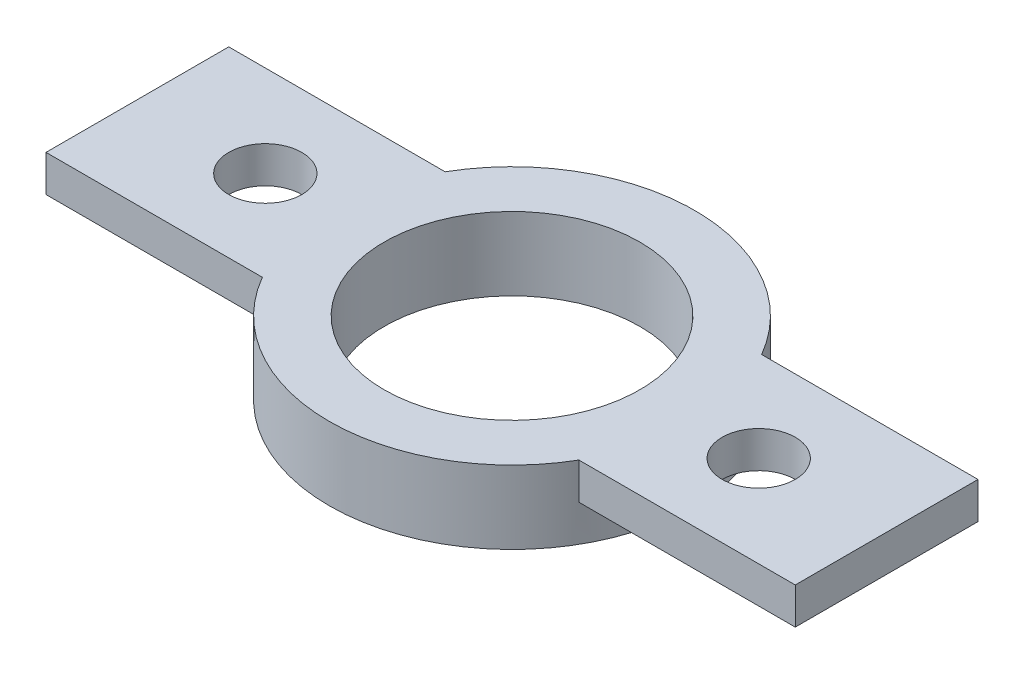
ISO-10303-21;
HEADER;
FILE_DESCRIPTION(('STEP AP214'),'2;1');
FILE_NAME('part.step','',(''),(''),'','','');
FILE_SCHEMA(('AUTOMOTIVE_DESIGN { 1 0 10303 214 1 1 1 1 }'));
ENDSEC;
DATA;
#1=APPLICATION_CONTEXT('core data for automotive mechanical design processes');
#2=APPLICATION_PROTOCOL_DEFINITION('international standard','automotive_design',2000,#1);
#3=PRODUCT_CONTEXT('',#1,'mechanical');
#4=PRODUCT('Part','Part','',(#3));
#5=PRODUCT_RELATED_PRODUCT_CATEGORY('part','',(#4));
#6=PRODUCT_DEFINITION_FORMATION('','',#4);
#7=PRODUCT_DEFINITION_CONTEXT('part definition',#1,'design');
#8=PRODUCT_DEFINITION('design','',#6,#7);
#9=PRODUCT_DEFINITION_SHAPE('','',#8);
#10=(LENGTH_UNIT() NAMED_UNIT(*) SI_UNIT(.MILLI.,.METRE.));
#11=(NAMED_UNIT(*) PLANE_ANGLE_UNIT() SI_UNIT($,.RADIAN.));
#12=(NAMED_UNIT(*) SI_UNIT($,.STERADIAN.) SOLID_ANGLE_UNIT());
#13=UNCERTAINTY_MEASURE_WITH_UNIT(LENGTH_MEASURE(1.E-05),#10,'distance_accuracy_value','');
#14=(GEOMETRIC_REPRESENTATION_CONTEXT(3) GLOBAL_UNCERTAINTY_ASSIGNED_CONTEXT((#13)) GLOBAL_UNIT_ASSIGNED_CONTEXT((#10,
#11,#12)) REPRESENTATION_CONTEXT('',''));
#15=CARTESIAN_POINT('',(0.,0.,0.));
#16=DIRECTION('',(0.,0.,1.));
#17=DIRECTION('',(1.,0.,0.));
#18=AXIS2_PLACEMENT_3D('',#15,#16,#17);
#19=CARTESIAN_POINT('',(0.,2.,0.));
#20=DIRECTION('',(0.,0.,-1.));
#21=DIRECTION('',(-1.,0.,0.));
#22=AXIS2_PLACEMENT_3D('',#19,#20,#21);
#23=PLANE('',#22);
#24=DIRECTION('',(1.,0.,0.));
#25=VECTOR('',#24,1.);
#26=CARTESIAN_POINT('',(0.,0.,0.));
#27=LINE('',#26,#25);
#28=CARTESIAN_POINT('',(-3.,0.,0.));
#29=VERTEX_POINT('',#28);
#30=CARTESIAN_POINT('',(8.83974596215561,0.,0.));
#31=VERTEX_POINT('',#30);
#32=EDGE_CURVE('E109',#29,#31,#27,.T.);
#33=ORIENTED_EDGE('',*,*,#32,.T.);
#34=DIRECTION('',(0.,1.,0.));
#35=VECTOR('',#34,1.);
#36=CARTESIAN_POINT('',(8.83974596215561,-2.,0.));
#37=LINE('',#36,#35);
#38=CARTESIAN_POINT('',(8.83974596215561,2.,0.));
#39=VERTEX_POINT('',#38);
#40=EDGE_CURVE('E162',#31,#39,#37,.T.);
#41=ORIENTED_EDGE('',*,*,#40,.T.);
#42=DIRECTION('',(1.,0.,0.));
#43=VECTOR('',#42,1.);
#44=CARTESIAN_POINT('',(0.,2.,0.));
#45=LINE('',#44,#43);
#46=CARTESIAN_POINT('',(-3.,2.,0.));
#47=VERTEX_POINT('',#46);
#48=EDGE_CURVE('E166',#47,#39,#45,.T.);
#49=ORIENTED_EDGE('',*,*,#48,.F.);
#50=DIRECTION('',(0.,1.,0.));
#51=VECTOR('',#50,1.);
#52=CARTESIAN_POINT('',(-3.,2.,0.));
#53=LINE('',#52,#51);
#54=EDGE_CURVE('E128',#29,#47,#53,.T.);
#55=ORIENTED_EDGE('',*,*,#54,.F.);
#56=EDGE_LOOP('',(#33,#41,#49,#55));
#57=FACE_BOUND('',#56,.T.);
#58=ADVANCED_FACE('F33',(#57),#23,.F.);
#59=CARTESIAN_POINT('',(0.,2.,-10.));
#60=DIRECTION('',(0.,0.,1.));
#61=DIRECTION('',(1.,0.,0.));
#62=AXIS2_PLACEMENT_3D('',#59,#60,#61);
#63=PLANE('',#62);
#64=DIRECTION('',(-1.,0.,0.));
#65=VECTOR('',#64,1.);
#66=CARTESIAN_POINT('',(0.,0.,-10.));
#67=LINE('',#66,#65);
#68=CARTESIAN_POINT('',(38.,0.,-10.));
#69=VERTEX_POINT('',#68);
#70=CARTESIAN_POINT('',(26.1602540378444,0.,-10.));
#71=VERTEX_POINT('',#70);
#72=EDGE_CURVE('E114',#69,#71,#67,.T.);
#73=ORIENTED_EDGE('',*,*,#72,.T.);
#74=DIRECTION('',(0.,1.,0.));
#75=VECTOR('',#74,1.);
#76=CARTESIAN_POINT('',(26.1602540378444,-2.,-10.));
#77=LINE('',#76,#75);
#78=CARTESIAN_POINT('',(26.1602540378444,2.,-10.));
#79=VERTEX_POINT('',#78);
#80=EDGE_CURVE('E58',#71,#79,#77,.T.);
#81=ORIENTED_EDGE('',*,*,#80,.T.);
#82=DIRECTION('',(-1.,0.,0.));
#83=VECTOR('',#82,1.);
#84=CARTESIAN_POINT('',(0.,2.,-10.));
#85=LINE('',#84,#83);
#86=CARTESIAN_POINT('',(38.,2.,-10.));
#87=VERTEX_POINT('',#86);
#88=EDGE_CURVE('E170',#87,#79,#85,.T.);
#89=ORIENTED_EDGE('',*,*,#88,.F.);
#90=DIRECTION('',(0.,1.,0.));
#91=VECTOR('',#90,1.);
#92=CARTESIAN_POINT('',(38.,0.,-10.));
#93=LINE('',#92,#91);
#94=EDGE_CURVE('E118',#69,#87,#93,.T.);
#95=ORIENTED_EDGE('',*,*,#94,.F.);
#96=EDGE_LOOP('',(#73,#81,#89,#95));
#97=FACE_BOUND('',#96,.T.);
#98=ADVANCED_FACE('F197',(#97),#63,.F.);
#99=CARTESIAN_POINT('',(0.,0.,0.));
#100=DIRECTION('',(0.,-1.,0.));
#101=DIRECTION('',(0.,0.,-1.));
#102=AXIS2_PLACEMENT_3D('',#99,#100,#101);
#103=PLANE('',#102);
#104=CARTESIAN_POINT('',(31.,0.,-5.));
#105=DIRECTION('',(0.,-1.,0.));
#106=DIRECTION('',(0.,0.,-1.));
#107=AXIS2_PLACEMENT_3D('',#104,#105,#106);
#108=CIRCLE('',#107,2.00000000000001);
#109=CARTESIAN_POINT('',(31.,0.,-7.00000000000001));
#110=VERTEX_POINT('',#109);
#111=EDGE_CURVE('E140',#110,#110,#108,.T.);
#112=ORIENTED_EDGE('',*,*,#111,.F.);
#113=EDGE_LOOP('',(#112));
#114=FACE_BOUND('',#113,.T.);
#115=CARTESIAN_POINT('',(17.5,0.,-5.));
#116=DIRECTION('',(0.,-1.,0.));
#117=DIRECTION('',(0.,0.,-1.));
#118=AXIS2_PLACEMENT_3D('',#115,#116,#117);
#119=CIRCLE('',#118,10.);
#120=CARTESIAN_POINT('',(26.1602540378444,0.,0.));
#121=VERTEX_POINT('',#120);
#122=EDGE_CURVE('E11',#71,#121,#119,.T.);
#123=ORIENTED_EDGE('',*,*,#122,.F.);
#124=ORIENTED_EDGE('',*,*,#72,.F.);
#125=DIRECTION('',(0.,0.,-1.));
#126=VECTOR('',#125,1.);
#127=CARTESIAN_POINT('',(38.,0.,0.));
#128=LINE('',#127,#126);
#129=CARTESIAN_POINT('',(38.,0.,0.));
#130=VERTEX_POINT('',#129);
#131=EDGE_CURVE('E112',#130,#69,#128,.T.);
#132=ORIENTED_EDGE('',*,*,#131,.F.);
#133=EDGE_CURVE('E102',#121,#130,#27,.T.);
#134=ORIENTED_EDGE('',*,*,#133,.F.);
#135=EDGE_LOOP('',(#123,#124,#132,#134));
#136=FACE_BOUND('',#135,.T.);
#137=ADVANCED_FACE('F113',(#114,#136),#103,.T.);
#138=CARTESIAN_POINT('',(26.1602540378444,2.,0.));
#139=VERTEX_POINT('',#138);
#140=CARTESIAN_POINT('',(38.,2.,0.));
#141=VERTEX_POINT('',#140);
#142=EDGE_CURVE('E169',#139,#141,#45,.T.);
#143=ORIENTED_EDGE('',*,*,#142,.F.);
#144=DIRECTION('',(0.,1.,0.));
#145=VECTOR('',#144,1.);
#146=CARTESIAN_POINT('',(26.1602540378444,-2.,0.));
#147=LINE('',#146,#145);
#148=EDGE_CURVE('E107',#139,#121,#147,.F.);
#149=ORIENTED_EDGE('',*,*,#148,.T.);
#150=ORIENTED_EDGE('',*,*,#133,.T.);
#151=DIRECTION('',(0.,-1.,0.));
#152=VECTOR('',#151,1.);
#153=CARTESIAN_POINT('',(38.,0.,0.));
#154=LINE('',#153,#152);
#155=EDGE_CURVE('E105',#141,#130,#154,.T.);
#156=ORIENTED_EDGE('',*,*,#155,.F.);
#157=EDGE_LOOP('',(#143,#149,#150,#156));
#158=FACE_BOUND('',#157,.T.);
#159=ADVANCED_FACE('F35',(#158),#23,.F.);
#160=CARTESIAN_POINT('',(8.83974596215561,2.,-10.));
#161=VERTEX_POINT('',#160);
#162=CARTESIAN_POINT('',(-3.,2.,-10.));
#163=VERTEX_POINT('',#162);
#164=EDGE_CURVE('E50',#161,#163,#85,.T.);
#165=ORIENTED_EDGE('',*,*,#164,.F.);
#166=DIRECTION('',(0.,1.,0.));
#167=VECTOR('',#166,1.);
#168=CARTESIAN_POINT('',(8.83974596215561,-2.,-10.));
#169=LINE('',#168,#167);
#170=CARTESIAN_POINT('',(8.83974596215561,0.,-10.));
#171=VERTEX_POINT('',#170);
#172=EDGE_CURVE('E156',#161,#171,#169,.F.);
#173=ORIENTED_EDGE('',*,*,#172,.T.);
#174=CARTESIAN_POINT('',(-3.,0.,-10.));
#175=VERTEX_POINT('',#174);
#176=EDGE_CURVE('E173',#171,#175,#67,.T.);
#177=ORIENTED_EDGE('',*,*,#176,.T.);
#178=DIRECTION('',(0.,-1.,0.));
#179=VECTOR('',#178,1.);
#180=CARTESIAN_POINT('',(-3.,2.,-10.));
#181=LINE('',#180,#179);
#182=EDGE_CURVE('E134',#163,#175,#181,.T.);
#183=ORIENTED_EDGE('',*,*,#182,.F.);
#184=EDGE_LOOP('',(#165,#173,#177,#183));
#185=FACE_BOUND('',#184,.T.);
#186=ADVANCED_FACE('F203',(#185),#63,.F.);
#187=CARTESIAN_POINT('',(0.,2.,0.));
#188=DIRECTION('',(0.,-1.,0.));
#189=DIRECTION('',(0.,0.,-1.));
#190=AXIS2_PLACEMENT_3D('',#187,#188,#189);
#191=PLANE('',#190);
#192=CARTESIAN_POINT('',(4.,2.,-5.));
#193=DIRECTION('',(0.,-1.,0.));
#194=DIRECTION('',(0.,0.,-1.));
#195=AXIS2_PLACEMENT_3D('',#192,#193,#194);
#196=CIRCLE('',#195,2.);
#197=CARTESIAN_POINT('',(4.,2.,-7.));
#198=VERTEX_POINT('',#197);
#199=EDGE_CURVE('E144',#198,#198,#196,.T.);
#200=ORIENTED_EDGE('',*,*,#199,.T.);
#201=EDGE_LOOP('',(#200));
#202=FACE_BOUND('',#201,.T.);
#203=CARTESIAN_POINT('',(31.,2.,-5.));
#204=DIRECTION('',(0.,-1.,0.));
#205=DIRECTION('',(0.,0.,-1.));
#206=AXIS2_PLACEMENT_3D('',#203,#204,#205);
#207=CIRCLE('',#206,2.00000000000001);
#208=CARTESIAN_POINT('',(31.,2.,-7.00000000000001));
#209=VERTEX_POINT('',#208);
#210=EDGE_CURVE('E37',#209,#209,#207,.T.);
#211=ORIENTED_EDGE('',*,*,#210,.T.);
#212=EDGE_LOOP('',(#211));
#213=FACE_BOUND('',#212,.T.);
#214=CARTESIAN_POINT('',(17.5,2.,-5.));
#215=DIRECTION('',(0.,1.,0.));
#216=DIRECTION('',(0.,0.,1.));
#217=AXIS2_PLACEMENT_3D('',#214,#215,#216);
#218=CIRCLE('',#217,7.);
#219=CARTESIAN_POINT('',(17.5,2.,2.));
#220=VERTEX_POINT('',#219);
#221=EDGE_CURVE('E149',#220,#220,#218,.T.);
#222=ORIENTED_EDGE('',*,*,#221,.F.);
#223=EDGE_LOOP('',(#222));
#224=FACE_BOUND('',#223,.T.);
#225=ORIENTED_EDGE('',*,*,#48,.T.);
#226=CARTESIAN_POINT('',(17.5,2.,-5.));
#227=DIRECTION('',(0.,1.,0.));
#228=DIRECTION('',(0.,0.,1.));
#229=AXIS2_PLACEMENT_3D('',#226,#227,#228);
#230=CIRCLE('',#229,10.);
#231=EDGE_CURVE('E158',#39,#139,#230,.T.);
#232=ORIENTED_EDGE('',*,*,#231,.T.);
#233=ORIENTED_EDGE('',*,*,#142,.T.);
#234=DIRECTION('',(0.,0.,1.));
#235=VECTOR('',#234,1.);
#236=CARTESIAN_POINT('',(38.,2.,0.));
#237=LINE('',#236,#235);
#238=EDGE_CURVE('E123',#87,#141,#237,.T.);
#239=ORIENTED_EDGE('',*,*,#238,.F.);
#240=ORIENTED_EDGE('',*,*,#88,.T.);
#241=EDGE_CURVE('E157',#79,#161,#230,.T.);
#242=ORIENTED_EDGE('',*,*,#241,.T.);
#243=ORIENTED_EDGE('',*,*,#164,.T.);
#244=DIRECTION('',(0.,0.,-1.));
#245=VECTOR('',#244,1.);
#246=CARTESIAN_POINT('',(-3.,2.,0.));
#247=LINE('',#246,#245);
#248=EDGE_CURVE('E131',#47,#163,#247,.T.);
#249=ORIENTED_EDGE('',*,*,#248,.F.);
#250=EDGE_LOOP('',(#225,#232,#233,#239,#240,#242,#243,#249));
#251=FACE_BOUND('',#250,.T.);
#252=ADVANCED_FACE('F209',(#202,#213,#224,#251),#191,.F.);
#253=CARTESIAN_POINT('',(4.,0.,-5.));
#254=DIRECTION('',(0.,-1.,0.));
#255=DIRECTION('',(0.,0.,-1.));
#256=AXIS2_PLACEMENT_3D('',#253,#254,#255);
#257=CIRCLE('',#256,2.);
#258=CARTESIAN_POINT('',(4.,0.,-7.));
#259=VERTEX_POINT('',#258);
#260=EDGE_CURVE('E141',#259,#259,#257,.T.);
#261=ORIENTED_EDGE('',*,*,#260,.F.);
#262=EDGE_LOOP('',(#261));
#263=FACE_BOUND('',#262,.T.);
#264=EDGE_CURVE('E42',#31,#171,#119,.T.);
#265=ORIENTED_EDGE('',*,*,#264,.F.);
#266=ORIENTED_EDGE('',*,*,#32,.F.);
#267=DIRECTION('',(0.,0.,1.));
#268=VECTOR('',#267,1.);
#269=CARTESIAN_POINT('',(-3.,0.,0.));
#270=LINE('',#269,#268);
#271=EDGE_CURVE('E137',#175,#29,#270,.T.);
#272=ORIENTED_EDGE('',*,*,#271,.F.);
#273=ORIENTED_EDGE('',*,*,#176,.F.);
#274=EDGE_LOOP('',(#265,#266,#272,#273));
#275=FACE_BOUND('',#274,.T.);
#276=ADVANCED_FACE('F212',(#263,#275),#103,.T.);
#277=CARTESIAN_POINT('',(17.5,-2.,-5.));
#278=DIRECTION('',(0.,1.,0.));
#279=DIRECTION('',(0.,0.,1.));
#280=AXIS2_PLACEMENT_3D('',#277,#278,#279);
#281=CYLINDRICAL_SURFACE('',#280,10.);
#282=CARTESIAN_POINT('',(17.5,-2.,-5.));
#283=DIRECTION('',(0.,1.,0.));
#284=DIRECTION('',(0.,0.,1.));
#285=AXIS2_PLACEMENT_3D('',#282,#283,#284);
#286=CIRCLE('',#285,10.);
#287=CARTESIAN_POINT('',(17.5,-2.,5.));
#288=VERTEX_POINT('',#287);
#289=EDGE_CURVE('E153',#288,#288,#286,.T.);
#290=ORIENTED_EDGE('',*,*,#289,.T.);
#291=EDGE_LOOP('',(#290));
#292=FACE_BOUND('',#291,.T.);
#293=ORIENTED_EDGE('',*,*,#148,.F.);
#294=ORIENTED_EDGE('',*,*,#231,.F.);
#295=ORIENTED_EDGE('',*,*,#40,.F.);
#296=ORIENTED_EDGE('',*,*,#264,.T.);
#297=ORIENTED_EDGE('',*,*,#172,.F.);
#298=ORIENTED_EDGE('',*,*,#241,.F.);
#299=ORIENTED_EDGE('',*,*,#80,.F.);
#300=ORIENTED_EDGE('',*,*,#122,.T.);
#301=EDGE_LOOP('',(#293,#294,#295,#296,#297,#298,#299,#300));
#302=FACE_BOUND('',#301,.T.);
#303=ADVANCED_FACE('F193',(#292,#302),#281,.T.);
#304=CARTESIAN_POINT('',(17.5,-2.,-5.));
#305=DIRECTION('',(0.,1.,0.));
#306=DIRECTION('',(0.,0.,1.));
#307=AXIS2_PLACEMENT_3D('',#304,#305,#306);
#308=PLANE('',#307);
#309=CARTESIAN_POINT('',(17.5,-2.,-5.));
#310=DIRECTION('',(0.,1.,0.));
#311=DIRECTION('',(0.,0.,1.));
#312=AXIS2_PLACEMENT_3D('',#309,#310,#311);
#313=CIRCLE('',#312,7.);
#314=CARTESIAN_POINT('',(17.5,-2.,2.));
#315=VERTEX_POINT('',#314);
#316=EDGE_CURVE('E152',#315,#315,#313,.T.);
#317=ORIENTED_EDGE('',*,*,#316,.T.);
#318=EDGE_LOOP('',(#317));
#319=FACE_BOUND('',#318,.T.);
#320=ORIENTED_EDGE('',*,*,#289,.F.);
#321=EDGE_LOOP('',(#320));
#322=FACE_BOUND('',#321,.T.);
#323=ADVANCED_FACE('F178',(#319,#322),#308,.F.);
#324=CARTESIAN_POINT('',(17.5,-1998.,-5.));
#325=DIRECTION('',(0.,1.,0.));
#326=DIRECTION('',(0.,0.,1.));
#327=AXIS2_PLACEMENT_3D('',#324,#325,#326);
#328=CYLINDRICAL_SURFACE('',#327,7.);
#329=ORIENTED_EDGE('',*,*,#221,.T.);
#330=EDGE_LOOP('',(#329));
#331=FACE_BOUND('',#330,.T.);
#332=ORIENTED_EDGE('',*,*,#316,.F.);
#333=EDGE_LOOP('',(#332));
#334=FACE_BOUND('',#333,.T.);
#335=ADVANCED_FACE('F181',(#331,#334),#328,.F.);
#336=CARTESIAN_POINT('',(4.,20.,-5.));
#337=DIRECTION('',(0.,-1.,0.));
#338=DIRECTION('',(0.,0.,-1.));
#339=AXIS2_PLACEMENT_3D('',#336,#337,#338);
#340=CYLINDRICAL_SURFACE('',#339,2.);
#341=ORIENTED_EDGE('',*,*,#260,.T.);
#342=EDGE_LOOP('',(#341));
#343=FACE_BOUND('',#342,.T.);
#344=ORIENTED_EDGE('',*,*,#199,.F.);
#345=EDGE_LOOP('',(#344));
#346=FACE_BOUND('',#345,.T.);
#347=ADVANCED_FACE('F183',(#343,#346),#340,.F.);
#348=CARTESIAN_POINT('',(31.,20.,-5.));
#349=DIRECTION('',(0.,-1.,0.));
#350=DIRECTION('',(0.,0.,-1.));
#351=AXIS2_PLACEMENT_3D('',#348,#349,#350);
#352=CYLINDRICAL_SURFACE('',#351,2.00000000000001);
#353=ORIENTED_EDGE('',*,*,#111,.T.);
#354=EDGE_LOOP('',(#353));
#355=FACE_BOUND('',#354,.T.);
#356=ORIENTED_EDGE('',*,*,#210,.F.);
#357=EDGE_LOOP('',(#356));
#358=FACE_BOUND('',#357,.T.);
#359=ADVANCED_FACE('F190',(#355,#358),#352,.F.);
#360=CARTESIAN_POINT('',(-3.,0.,0.));
#361=DIRECTION('',(1.,0.,0.));
#362=DIRECTION('',(0.,0.,-1.));
#363=AXIS2_PLACEMENT_3D('',#360,#361,#362);
#364=PLANE('',#363);
#365=ORIENTED_EDGE('',*,*,#54,.T.);
#366=ORIENTED_EDGE('',*,*,#248,.T.);
#367=ORIENTED_EDGE('',*,*,#182,.T.);
#368=ORIENTED_EDGE('',*,*,#271,.T.);
#369=EDGE_LOOP('',(#365,#366,#367,#368));
#370=FACE_BOUND('',#369,.T.);
#371=ADVANCED_FACE('F238',(#370),#364,.F.);
#372=CARTESIAN_POINT('',(38.,0.,0.));
#373=DIRECTION('',(-1.,0.,0.));
#374=DIRECTION('',(0.,0.,1.));
#375=AXIS2_PLACEMENT_3D('',#372,#373,#374);
#376=PLANE('',#375);
#377=ORIENTED_EDGE('',*,*,#155,.T.);
#378=ORIENTED_EDGE('',*,*,#131,.T.);
#379=ORIENTED_EDGE('',*,*,#94,.T.);
#380=ORIENTED_EDGE('',*,*,#238,.T.);
#381=EDGE_LOOP('',(#377,#378,#379,#380));
#382=FACE_BOUND('',#381,.T.);
#383=ADVANCED_FACE('F121',(#382),#376,.F.);
#384=CLOSED_SHELL('',(#58,#98,#137,#159,#186,#252,#276,#303,#323,#335,#347,#359,#371,#383));
#385=MANIFOLD_SOLID_BREP('B2',#384);
#386=ADVANCED_BREP_SHAPE_REPRESENTATION('',(#18,#385),#14);
#387=SHAPE_DEFINITION_REPRESENTATION(#9,#386);
ENDSEC;
END-ISO-10303-21;
